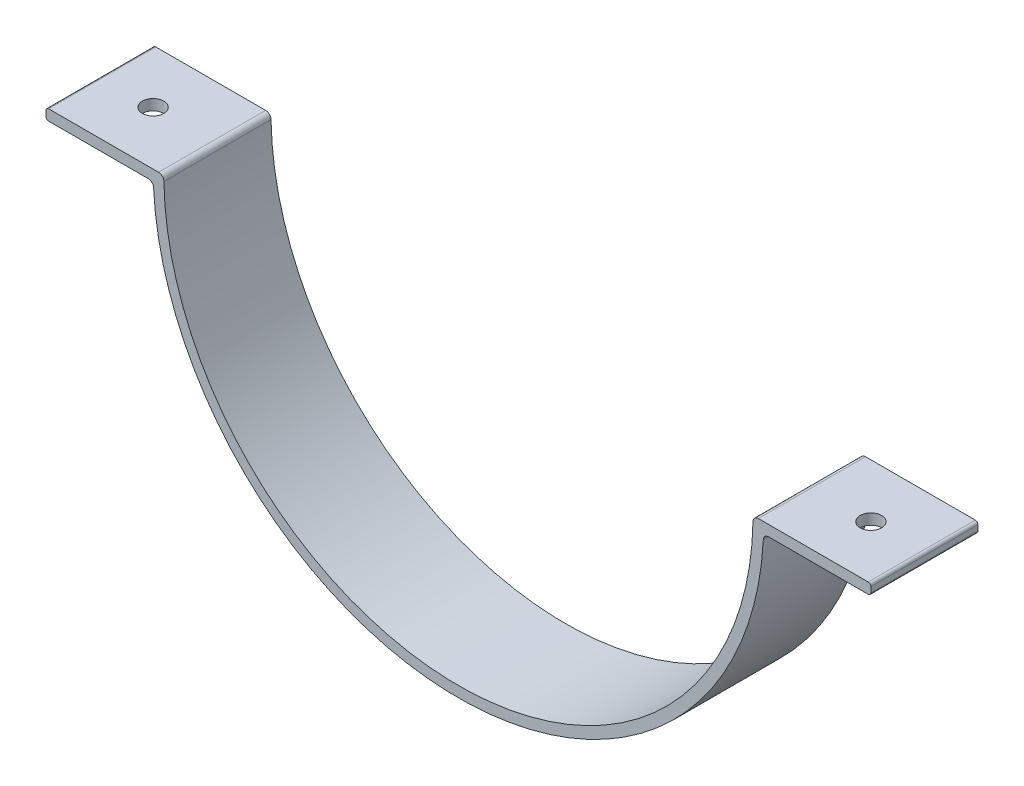
ISO-10303-21;
HEADER;
FILE_DESCRIPTION(('STEP AP214'),'2;1');
FILE_NAME('part.step','',(''),(''),'','','');
FILE_SCHEMA(('AUTOMOTIVE_DESIGN { 1 0 10303 214 1 1 1 1 }'));
ENDSEC;
DATA;
#1=APPLICATION_CONTEXT('core data for automotive mechanical design processes');
#2=APPLICATION_PROTOCOL_DEFINITION('international standard','automotive_design',2000,#1);
#3=PRODUCT_CONTEXT('',#1,'mechanical');
#4=PRODUCT('Part','Part','',(#3));
#5=PRODUCT_RELATED_PRODUCT_CATEGORY('part','',(#4));
#6=PRODUCT_DEFINITION_FORMATION('','',#4);
#7=PRODUCT_DEFINITION_CONTEXT('part definition',#1,'design');
#8=PRODUCT_DEFINITION('design','',#6,#7);
#9=PRODUCT_DEFINITION_SHAPE('','',#8);
#10=(LENGTH_UNIT() NAMED_UNIT(*) SI_UNIT(.MILLI.,.METRE.));
#11=(NAMED_UNIT(*) PLANE_ANGLE_UNIT() SI_UNIT($,.RADIAN.));
#12=(NAMED_UNIT(*) SI_UNIT($,.STERADIAN.) SOLID_ANGLE_UNIT());
#13=UNCERTAINTY_MEASURE_WITH_UNIT(LENGTH_MEASURE(1.E-05),#10,'distance_accuracy_value','');
#14=(GEOMETRIC_REPRESENTATION_CONTEXT(3) GLOBAL_UNCERTAINTY_ASSIGNED_CONTEXT((#13)) GLOBAL_UNIT_ASSIGNED_CONTEXT((#10,
#11,#12)) REPRESENTATION_CONTEXT('',''));
#15=CARTESIAN_POINT('',(0.,0.,0.));
#16=DIRECTION('',(0.,0.,1.));
#17=DIRECTION('',(1.,0.,0.));
#18=AXIS2_PLACEMENT_3D('',#15,#16,#17);
#19=CARTESIAN_POINT('',(-57.9223618302983,-3.,20.));
#20=DIRECTION('',(0.,0.,-1.));
#21=DIRECTION('',(-1.,0.,0.));
#22=AXIS2_PLACEMENT_3D('',#19,#20,#21);
#23=CYLINDRICAL_SURFACE('',#22,1.);
#24=CARTESIAN_POINT('',(-57.9223618302983,-3.,0.));
#25=DIRECTION('',(0.,0.,-1.));
#26=DIRECTION('',(1.,0.,0.));
#27=AXIS2_PLACEMENT_3D('',#24,#25,#26);
#28=CIRCLE('',#27,1.);
#29=CARTESIAN_POINT('',(-57.9223618302983,-2.,0.));
#30=VERTEX_POINT('',#29);
#31=CARTESIAN_POINT('',(-56.9237004194311,-2.94827586206897,0.));
#32=VERTEX_POINT('',#31);
#33=EDGE_CURVE('E178',#30,#32,#28,.T.);
#34=ORIENTED_EDGE('',*,*,#33,.T.);
#35=DIRECTION('',(0.,0.,-1.));
#36=VECTOR('',#35,1.);
#37=CARTESIAN_POINT('',(-56.9237004194311,-2.94827586206897,20.));
#38=LINE('',#37,#36);
#39=CARTESIAN_POINT('',(-56.9237004194311,-2.94827586206897,20.));
#40=VERTEX_POINT('',#39);
#41=EDGE_CURVE('E11',#40,#32,#38,.T.);
#42=ORIENTED_EDGE('',*,*,#41,.F.);
#43=CARTESIAN_POINT('',(-57.9223618302983,-3.,20.));
#44=DIRECTION('',(0.,0.,-1.));
#45=DIRECTION('',(1.,0.,0.));
#46=AXIS2_PLACEMENT_3D('',#43,#44,#45);
#47=CIRCLE('',#46,1.);
#48=CARTESIAN_POINT('',(-57.9223618302983,-2.,20.));
#49=VERTEX_POINT('',#48);
#50=EDGE_CURVE('E211',#49,#40,#47,.T.);
#51=ORIENTED_EDGE('',*,*,#50,.F.);
#52=DIRECTION('',(0.,0.,-1.));
#53=VECTOR('',#52,1.);
#54=CARTESIAN_POINT('',(-57.9223618302983,-2.,20.));
#55=LINE('',#54,#53);
#56=EDGE_CURVE('E174',#49,#30,#55,.T.);
#57=ORIENTED_EDGE('',*,*,#56,.T.);
#58=EDGE_LOOP('',(#34,#42,#51,#57));
#59=FACE_BOUND('',#58,.T.);
#60=ADVANCED_FACE('F32',(#59),#23,.F.);
#61=CARTESIAN_POINT('',(0.,0.,20.));
#62=DIRECTION('',(0.,0.,-1.));
#63=DIRECTION('',(-1.,0.,0.));
#64=AXIS2_PLACEMENT_3D('',#61,#62,#63);
#65=CYLINDRICAL_SURFACE('',#64,57.);
#66=CARTESIAN_POINT('',(0.,0.,0.));
#67=DIRECTION('',(0.,0.,1.));
#68=DIRECTION('',(1.,0.,0.));
#69=AXIS2_PLACEMENT_3D('',#66,#67,#68);
#70=CIRCLE('',#69,57.);
#71=CARTESIAN_POINT('',(56.9237004194311,-2.94827586206896,0.));
#72=VERTEX_POINT('',#71);
#73=EDGE_CURVE('E181',#32,#72,#70,.T.);
#74=ORIENTED_EDGE('',*,*,#73,.T.);
#75=DIRECTION('',(0.,0.,-1.));
#76=VECTOR('',#75,1.);
#77=CARTESIAN_POINT('',(56.9237004194311,-2.94827586206896,20.));
#78=LINE('',#77,#76);
#79=CARTESIAN_POINT('',(56.9237004194311,-2.94827586206896,20.));
#80=VERTEX_POINT('',#79);
#81=EDGE_CURVE('E41',#80,#72,#78,.T.);
#82=ORIENTED_EDGE('',*,*,#81,.F.);
#83=CARTESIAN_POINT('',(0.,0.,20.));
#84=DIRECTION('',(0.,0.,1.));
#85=DIRECTION('',(1.,0.,0.));
#86=AXIS2_PLACEMENT_3D('',#83,#84,#85);
#87=CIRCLE('',#86,57.);
#88=EDGE_CURVE('E117',#40,#80,#87,.T.);
#89=ORIENTED_EDGE('',*,*,#88,.F.);
#90=ORIENTED_EDGE('',*,*,#41,.T.);
#91=EDGE_LOOP('',(#74,#82,#89,#90));
#92=FACE_BOUND('',#91,.T.);
#93=ADVANCED_FACE('F309',(#92),#65,.T.);
#94=CARTESIAN_POINT('',(57.9223618302983,-3.,20.));
#95=DIRECTION('',(0.,0.,-1.));
#96=DIRECTION('',(-1.,0.,0.));
#97=AXIS2_PLACEMENT_3D('',#94,#95,#96);
#98=CYLINDRICAL_SURFACE('',#97,1.);
#99=CARTESIAN_POINT('',(57.9223618302983,-3.,0.));
#100=DIRECTION('',(0.,0.,-1.));
#101=DIRECTION('',(-1.,0.,0.));
#102=AXIS2_PLACEMENT_3D('',#99,#100,#101);
#103=CIRCLE('',#102,1.);
#104=CARTESIAN_POINT('',(57.9223618302983,-2.,0.));
#105=VERTEX_POINT('',#104);
#106=EDGE_CURVE('E184',#72,#105,#103,.T.);
#107=ORIENTED_EDGE('',*,*,#106,.T.);
#108=DIRECTION('',(0.,0.,-1.));
#109=VECTOR('',#108,1.);
#110=CARTESIAN_POINT('',(57.9223618302983,-2.,20.));
#111=LINE('',#110,#109);
#112=CARTESIAN_POINT('',(57.9223618302983,-2.,20.));
#113=VERTEX_POINT('',#112);
#114=EDGE_CURVE('E242',#113,#105,#111,.T.);
#115=ORIENTED_EDGE('',*,*,#114,.F.);
#116=CARTESIAN_POINT('',(57.9223618302983,-3.,20.));
#117=DIRECTION('',(0.,0.,-1.));
#118=DIRECTION('',(-1.,0.,0.));
#119=AXIS2_PLACEMENT_3D('',#116,#117,#118);
#120=CIRCLE('',#119,1.);
#121=EDGE_CURVE('E261',#80,#113,#120,.T.);
#122=ORIENTED_EDGE('',*,*,#121,.F.);
#123=ORIENTED_EDGE('',*,*,#81,.T.);
#124=EDGE_LOOP('',(#107,#115,#122,#123));
#125=FACE_BOUND('',#124,.T.);
#126=ADVANCED_FACE('F313',(#125),#98,.F.);
#127=CARTESIAN_POINT('',(76.5,-2.,20.));
#128=DIRECTION('',(0.,1.,0.));
#129=DIRECTION('',(0.,0.,1.));
#130=AXIS2_PLACEMENT_3D('',#127,#128,#129);
#131=PLANE('',#130);
#132=CARTESIAN_POINT('',(66.9999999999997,-2.,10.));
#133=DIRECTION('',(0.,1.,0.));
#134=DIRECTION('',(0.,0.,1.));
#135=AXIS2_PLACEMENT_3D('',#132,#133,#134);
#136=CIRCLE('',#135,2.);
#137=CARTESIAN_POINT('',(66.9999999999997,-2.,12.));
#138=VERTEX_POINT('',#137);
#139=EDGE_CURVE('E182',#138,#138,#136,.T.);
#140=ORIENTED_EDGE('',*,*,#139,.T.);
#141=EDGE_LOOP('',(#140));
#142=FACE_BOUND('',#141,.T.);
#143=DIRECTION('',(1.,0.,0.));
#144=VECTOR('',#143,1.);
#145=CARTESIAN_POINT('',(76.5,-2.,0.));
#146=LINE('',#145,#144);
#147=CARTESIAN_POINT('',(76.5,-2.,0.));
#148=VERTEX_POINT('',#147);
#149=EDGE_CURVE('E186',#105,#148,#146,.T.);
#150=ORIENTED_EDGE('',*,*,#149,.T.);
#151=DIRECTION('',(0.,0.,-1.));
#152=VECTOR('',#151,1.);
#153=CARTESIAN_POINT('',(76.5,-2.,20.));
#154=LINE('',#153,#152);
#155=CARTESIAN_POINT('',(76.5,-2.,20.));
#156=VERTEX_POINT('',#155);
#157=EDGE_CURVE('E239',#156,#148,#154,.T.);
#158=ORIENTED_EDGE('',*,*,#157,.F.);
#159=DIRECTION('',(1.,0.,0.));
#160=VECTOR('',#159,1.);
#161=CARTESIAN_POINT('',(76.5,-2.,20.));
#162=LINE('',#161,#160);
#163=EDGE_CURVE('E263',#113,#156,#162,.T.);
#164=ORIENTED_EDGE('',*,*,#163,.F.);
#165=ORIENTED_EDGE('',*,*,#114,.T.);
#166=EDGE_LOOP('',(#150,#158,#164,#165));
#167=FACE_BOUND('',#166,.T.);
#168=ADVANCED_FACE('F317',(#142,#167),#131,.F.);
#169=CARTESIAN_POINT('',(76.5,-1.5,20.));
#170=DIRECTION('',(0.,0.,-1.));
#171=DIRECTION('',(-1.,0.,0.));
#172=AXIS2_PLACEMENT_3D('',#169,#170,#171);
#173=CYLINDRICAL_SURFACE('',#172,0.5);
#174=CARTESIAN_POINT('',(76.5,-1.5,0.));
#175=DIRECTION('',(0.,0.,1.));
#176=DIRECTION('',(-1.,0.,0.));
#177=AXIS2_PLACEMENT_3D('',#174,#175,#176);
#178=CIRCLE('',#177,0.5);
#179=CARTESIAN_POINT('',(77.,-1.5,0.));
#180=VERTEX_POINT('',#179);
#181=EDGE_CURVE('E188',#148,#180,#178,.T.);
#182=ORIENTED_EDGE('',*,*,#181,.T.);
#183=DIRECTION('',(0.,0.,-1.));
#184=VECTOR('',#183,1.);
#185=CARTESIAN_POINT('',(77.,-1.5,20.));
#186=LINE('',#185,#184);
#187=CARTESIAN_POINT('',(77.,-1.5,20.));
#188=VERTEX_POINT('',#187);
#189=EDGE_CURVE('E236',#188,#180,#186,.T.);
#190=ORIENTED_EDGE('',*,*,#189,.F.);
#191=CARTESIAN_POINT('',(76.5,-1.5,20.));
#192=DIRECTION('',(0.,0.,1.));
#193=DIRECTION('',(-1.,0.,0.));
#194=AXIS2_PLACEMENT_3D('',#191,#192,#193);
#195=CIRCLE('',#194,0.5);
#196=EDGE_CURVE('E265',#156,#188,#195,.T.);
#197=ORIENTED_EDGE('',*,*,#196,.F.);
#198=ORIENTED_EDGE('',*,*,#157,.T.);
#199=EDGE_LOOP('',(#182,#190,#197,#198));
#200=FACE_BOUND('',#199,.T.);
#201=ADVANCED_FACE('F323',(#200),#173,.T.);
#202=CARTESIAN_POINT('',(77.,-0.500000000000018,20.));
#203=DIRECTION('',(-1.,0.,0.));
#204=DIRECTION('',(0.,-1.,0.));
#205=AXIS2_PLACEMENT_3D('',#202,#203,#204);
#206=PLANE('',#205);
#207=DIRECTION('',(0.,1.,0.));
#208=VECTOR('',#207,1.);
#209=CARTESIAN_POINT('',(77.,-0.500000000000018,0.));
#210=LINE('',#209,#208);
#211=CARTESIAN_POINT('',(77.,-0.500000000000018,0.));
#212=VERTEX_POINT('',#211);
#213=EDGE_CURVE('E190',#180,#212,#210,.T.);
#214=ORIENTED_EDGE('',*,*,#213,.T.);
#215=DIRECTION('',(0.,0.,-1.));
#216=VECTOR('',#215,1.);
#217=CARTESIAN_POINT('',(77.,-0.500000000000018,20.));
#218=LINE('',#217,#216);
#219=CARTESIAN_POINT('',(77.,-0.500000000000018,20.));
#220=VERTEX_POINT('',#219);
#221=EDGE_CURVE('E233',#220,#212,#218,.T.);
#222=ORIENTED_EDGE('',*,*,#221,.F.);
#223=DIRECTION('',(0.,1.,0.));
#224=VECTOR('',#223,1.);
#225=CARTESIAN_POINT('',(77.,-0.500000000000018,20.));
#226=LINE('',#225,#224);
#227=EDGE_CURVE('E267',#188,#220,#226,.T.);
#228=ORIENTED_EDGE('',*,*,#227,.F.);
#229=ORIENTED_EDGE('',*,*,#189,.T.);
#230=EDGE_LOOP('',(#214,#222,#228,#229));
#231=FACE_BOUND('',#230,.T.);
#232=ADVANCED_FACE('F327',(#231),#206,.F.);
#233=CARTESIAN_POINT('',(76.5,-0.500000000000011,20.));
#234=DIRECTION('',(0.,0.,-1.));
#235=DIRECTION('',(-1.,0.,0.));
#236=AXIS2_PLACEMENT_3D('',#233,#234,#235);
#237=CYLINDRICAL_SURFACE('',#236,0.5);
#238=CARTESIAN_POINT('',(76.5,-0.500000000000011,0.));
#239=DIRECTION('',(0.,0.,1.));
#240=DIRECTION('',(1.,0.,0.));
#241=AXIS2_PLACEMENT_3D('',#238,#239,#240);
#242=CIRCLE('',#241,0.5);
#243=CARTESIAN_POINT('',(76.5,0.,0.));
#244=VERTEX_POINT('',#243);
#245=EDGE_CURVE('E192',#212,#244,#242,.T.);
#246=ORIENTED_EDGE('',*,*,#245,.T.);
#247=DIRECTION('',(0.,0.,-1.));
#248=VECTOR('',#247,1.);
#249=CARTESIAN_POINT('',(76.5,0.,20.));
#250=LINE('',#249,#248);
#251=CARTESIAN_POINT('',(76.5,0.,20.));
#252=VERTEX_POINT('',#251);
#253=EDGE_CURVE('E230',#252,#244,#250,.T.);
#254=ORIENTED_EDGE('',*,*,#253,.F.);
#255=CARTESIAN_POINT('',(76.5,-0.500000000000011,20.));
#256=DIRECTION('',(0.,0.,1.));
#257=DIRECTION('',(1.,0.,0.));
#258=AXIS2_PLACEMENT_3D('',#255,#256,#257);
#259=CIRCLE('',#258,0.5);
#260=EDGE_CURVE('E269',#220,#252,#259,.T.);
#261=ORIENTED_EDGE('',*,*,#260,.F.);
#262=ORIENTED_EDGE('',*,*,#221,.T.);
#263=EDGE_LOOP('',(#246,#254,#261,#262));
#264=FACE_BOUND('',#263,.T.);
#265=ADVANCED_FACE('F331',(#264),#237,.T.);
#266=CARTESIAN_POINT('',(57.,-3.59018503583753E-13,20.));
#267=DIRECTION('',(-1.79509251791877E-13,-1.,0.));
#268=DIRECTION('',(1.,-1.79509251791877E-13,0.));
#269=AXIS2_PLACEMENT_3D('',#266,#267,#268);
#270=PLANE('',#269);
#271=CARTESIAN_POINT('',(67.0000000000001,-2.15799600411515E-12,10.));
#272=DIRECTION('',(-1.79509251791877E-13,-1.,0.));
#273=DIRECTION('',(1.,-1.79509251791877E-13,0.));
#274=AXIS2_PLACEMENT_3D('',#271,#272,#273);
#275=CIRCLE('',#274,2.);
#276=CARTESIAN_POINT('',(69.0000000000001,-2.5170145076989E-12,10.));
#277=VERTEX_POINT('',#276);
#278=EDGE_CURVE('E246',#277,#277,#275,.T.);
#279=ORIENTED_EDGE('',*,*,#278,.T.);
#280=EDGE_LOOP('',(#279));
#281=FACE_BOUND('',#280,.T.);
#282=DIRECTION('',(-1.,1.79509251791877E-13,0.));
#283=VECTOR('',#282,1.);
#284=CARTESIAN_POINT('',(57.,-3.59018503583753E-13,0.));
#285=LINE('',#284,#283);
#286=CARTESIAN_POINT('',(55.9910707166779,-1.77906362823681E-13,0.));
#287=VERTEX_POINT('',#286);
#288=EDGE_CURVE('E195',#244,#287,#285,.T.);
#289=ORIENTED_EDGE('',*,*,#288,.T.);
#290=DIRECTION('',(0.,0.,-1.));
#291=VECTOR('',#290,1.);
#292=CARTESIAN_POINT('',(55.9910707166779,-1.77906362823681E-13,20.));
#293=LINE('',#292,#291);
#294=CARTESIAN_POINT('',(55.9910707166779,-1.77906362823681E-13,20.));
#295=VERTEX_POINT('',#294);
#296=EDGE_CURVE('E227',#295,#287,#293,.T.);
#297=ORIENTED_EDGE('',*,*,#296,.F.);
#298=DIRECTION('',(-1.,0.,0.));
#299=VECTOR('',#298,1.);
#300=CARTESIAN_POINT('',(57.,-3.59018503583753E-13,20.));
#301=LINE('',#300,#299);
#302=EDGE_CURVE('E271',#252,#295,#301,.T.);
#303=ORIENTED_EDGE('',*,*,#302,.F.);
#304=ORIENTED_EDGE('',*,*,#253,.T.);
#305=EDGE_LOOP('',(#289,#297,#303,#304));
#306=FACE_BOUND('',#305,.T.);
#307=ADVANCED_FACE('F335',(#281,#306),#270,.F.);
#308=CARTESIAN_POINT('',(55.9910707166777,-1.00000000000018,20.));
#309=DIRECTION('',(0.,0.,-1.));
#310=DIRECTION('',(-1.,0.,0.));
#311=AXIS2_PLACEMENT_3D('',#308,#309,#310);
#312=CYLINDRICAL_SURFACE('',#311,0.999999999999999);
#313=CARTESIAN_POINT('',(55.9910707166777,-1.00000000000018,0.));
#314=DIRECTION('',(0.,0.,1.));
#315=DIRECTION('',(-1.,0.,0.));
#316=AXIS2_PLACEMENT_3D('',#313,#314,#315);
#317=CIRCLE('',#316,0.999999999999999);
#318=CARTESIAN_POINT('',(54.9912301681656,-0.982142857143032,0.));
#319=VERTEX_POINT('',#318);
#320=EDGE_CURVE('E197',#287,#319,#317,.T.);
#321=ORIENTED_EDGE('',*,*,#320,.T.);
#322=DIRECTION('',(0.,0.,-1.));
#323=VECTOR('',#322,1.);
#324=CARTESIAN_POINT('',(54.9912301681656,-0.982142857143032,20.));
#325=LINE('',#324,#323);
#326=CARTESIAN_POINT('',(54.9912301681656,-0.982142857143032,20.));
#327=VERTEX_POINT('',#326);
#328=EDGE_CURVE('E224',#327,#319,#325,.T.);
#329=ORIENTED_EDGE('',*,*,#328,.F.);
#330=CARTESIAN_POINT('',(55.9910707166777,-1.00000000000018,20.));
#331=DIRECTION('',(0.,0.,1.));
#332=DIRECTION('',(-1.,0.,0.));
#333=AXIS2_PLACEMENT_3D('',#330,#331,#332);
#334=CIRCLE('',#333,0.999999999999999);
#335=EDGE_CURVE('E273',#295,#327,#334,.T.);
#336=ORIENTED_EDGE('',*,*,#335,.F.);
#337=ORIENTED_EDGE('',*,*,#296,.T.);
#338=EDGE_LOOP('',(#321,#329,#336,#337));
#339=FACE_BOUND('',#338,.T.);
#340=ADVANCED_FACE('F339',(#339),#312,.T.);
#341=CARTESIAN_POINT('',(0.,0.,20.));
#342=DIRECTION('',(0.,0.,-1.));
#343=DIRECTION('',(-1.,0.,0.));
#344=AXIS2_PLACEMENT_3D('',#341,#342,#343);
#345=CYLINDRICAL_SURFACE('',#344,55.);
#346=CARTESIAN_POINT('',(0.,0.,0.));
#347=DIRECTION('',(0.,0.,-1.));
#348=DIRECTION('',(1.,0.,0.));
#349=AXIS2_PLACEMENT_3D('',#346,#347,#348);
#350=CIRCLE('',#349,55.);
#351=CARTESIAN_POINT('',(-54.9912301681656,-0.982142857143017,0.));
#352=VERTEX_POINT('',#351);
#353=EDGE_CURVE('E199',#319,#352,#350,.T.);
#354=ORIENTED_EDGE('',*,*,#353,.T.);
#355=DIRECTION('',(0.,0.,-1.));
#356=VECTOR('',#355,1.);
#357=CARTESIAN_POINT('',(-54.9912301681656,-0.982142857143017,20.));
#358=LINE('',#357,#356);
#359=CARTESIAN_POINT('',(-54.9912301681656,-0.982142857143017,20.));
#360=VERTEX_POINT('',#359);
#361=EDGE_CURVE('E221',#360,#352,#358,.T.);
#362=ORIENTED_EDGE('',*,*,#361,.F.);
#363=CARTESIAN_POINT('',(0.,0.,20.));
#364=DIRECTION('',(0.,0.,-1.));
#365=DIRECTION('',(1.,0.,0.));
#366=AXIS2_PLACEMENT_3D('',#363,#364,#365);
#367=CIRCLE('',#366,55.);
#368=EDGE_CURVE('E275',#327,#360,#367,.T.);
#369=ORIENTED_EDGE('',*,*,#368,.F.);
#370=ORIENTED_EDGE('',*,*,#328,.T.);
#371=EDGE_LOOP('',(#354,#362,#369,#370));
#372=FACE_BOUND('',#371,.T.);
#373=ADVANCED_FACE('F342',(#372),#345,.F.);
#374=CARTESIAN_POINT('',(-55.9910707166777,-1.00000000000018,20.));
#375=DIRECTION('',(0.,0.,-1.));
#376=DIRECTION('',(-1.,0.,0.));
#377=AXIS2_PLACEMENT_3D('',#374,#375,#376);
#378=CYLINDRICAL_SURFACE('',#377,0.999999999999999);
#379=CARTESIAN_POINT('',(-55.9910707166777,-1.00000000000018,0.));
#380=DIRECTION('',(0.,0.,1.));
#381=DIRECTION('',(1.,0.,0.));
#382=AXIS2_PLACEMENT_3D('',#379,#380,#381);
#383=CIRCLE('',#382,0.999999999999999);
#384=CARTESIAN_POINT('',(-55.9910707166779,-1.79110198894605E-13,0.));
#385=VERTEX_POINT('',#384);
#386=EDGE_CURVE('E201',#352,#385,#383,.T.);
#387=ORIENTED_EDGE('',*,*,#386,.T.);
#388=DIRECTION('',(0.,0.,-1.));
#389=VECTOR('',#388,1.);
#390=CARTESIAN_POINT('',(-55.9910707166779,-1.79110198894605E-13,20.));
#391=LINE('',#390,#389);
#392=CARTESIAN_POINT('',(-55.9910707166779,-1.79110198894605E-13,20.));
#393=VERTEX_POINT('',#392);
#394=EDGE_CURVE('E218',#393,#385,#391,.T.);
#395=ORIENTED_EDGE('',*,*,#394,.F.);
#396=CARTESIAN_POINT('',(-55.9910707166777,-1.00000000000018,20.));
#397=DIRECTION('',(0.,0.,1.));
#398=DIRECTION('',(1.,0.,0.));
#399=AXIS2_PLACEMENT_3D('',#396,#397,#398);
#400=CIRCLE('',#399,0.999999999999999);
#401=EDGE_CURVE('E277',#360,#393,#400,.T.);
#402=ORIENTED_EDGE('',*,*,#401,.F.);
#403=ORIENTED_EDGE('',*,*,#361,.T.);
#404=EDGE_LOOP('',(#387,#395,#402,#403));
#405=FACE_BOUND('',#404,.T.);
#406=ADVANCED_FACE('F346',(#405),#378,.T.);
#407=CARTESIAN_POINT('',(-57.,-3.59018503583753E-13,20.));
#408=DIRECTION('',(0.,-1.,0.));
#409=DIRECTION('',(1.,0.,0.));
#410=AXIS2_PLACEMENT_3D('',#407,#408,#409);
#411=PLANE('',#410);
#412=CARTESIAN_POINT('',(-67.0000000000001,-1.80411241501588E-13,10.));
#413=DIRECTION('',(0.,-1.,0.));
#414=DIRECTION('',(1.,0.,0.));
#415=AXIS2_PLACEMENT_3D('',#412,#413,#414);
#416=CIRCLE('',#415,2.);
#417=CARTESIAN_POINT('',(-65.0000000000001,-2.16068162500134E-13,10.));
#418=VERTEX_POINT('',#417);
#419=EDGE_CURVE('E248',#418,#418,#416,.F.);
#420=ORIENTED_EDGE('',*,*,#419,.F.);
#421=EDGE_LOOP('',(#420));
#422=FACE_BOUND('',#421,.T.);
#423=DIRECTION('',(-1.,0.,0.));
#424=VECTOR('',#423,1.);
#425=CARTESIAN_POINT('',(-57.,-3.59018503583753E-13,0.));
#426=LINE('',#425,#424);
#427=CARTESIAN_POINT('',(-76.5,0.,0.));
#428=VERTEX_POINT('',#427);
#429=EDGE_CURVE('E204',#385,#428,#426,.T.);
#430=ORIENTED_EDGE('',*,*,#429,.T.);
#431=DIRECTION('',(0.,0.,-1.));
#432=VECTOR('',#431,1.);
#433=CARTESIAN_POINT('',(-76.5,0.,20.));
#434=LINE('',#433,#432);
#435=CARTESIAN_POINT('',(-76.5,0.,20.));
#436=VERTEX_POINT('',#435);
#437=EDGE_CURVE('E215',#436,#428,#434,.T.);
#438=ORIENTED_EDGE('',*,*,#437,.F.);
#439=DIRECTION('',(-1.,-1.79509251791877E-13,0.));
#440=VECTOR('',#439,1.);
#441=CARTESIAN_POINT('',(-57.,-3.59018503583753E-13,20.));
#442=LINE('',#441,#440);
#443=EDGE_CURVE('E279',#393,#436,#442,.T.);
#444=ORIENTED_EDGE('',*,*,#443,.F.);
#445=ORIENTED_EDGE('',*,*,#394,.T.);
#446=EDGE_LOOP('',(#430,#438,#444,#445));
#447=FACE_BOUND('',#446,.T.);
#448=ADVANCED_FACE('F285',(#422,#447),#411,.F.);
#449=CARTESIAN_POINT('',(-76.5,-0.500000000000011,20.));
#450=DIRECTION('',(0.,0.,-1.));
#451=DIRECTION('',(-1.,0.,0.));
#452=AXIS2_PLACEMENT_3D('',#449,#450,#451);
#453=CYLINDRICAL_SURFACE('',#452,0.5);
#454=CARTESIAN_POINT('',(-76.5,-0.500000000000011,0.));
#455=DIRECTION('',(0.,0.,1.));
#456=DIRECTION('',(-1.,0.,0.));
#457=AXIS2_PLACEMENT_3D('',#454,#455,#456);
#458=CIRCLE('',#457,0.5);
#459=CARTESIAN_POINT('',(-77.,-0.500000000000019,0.));
#460=VERTEX_POINT('',#459);
#461=EDGE_CURVE('E206',#428,#460,#458,.T.);
#462=ORIENTED_EDGE('',*,*,#461,.T.);
#463=DIRECTION('',(0.,0.,-1.));
#464=VECTOR('',#463,1.);
#465=CARTESIAN_POINT('',(-77.,-0.500000000000019,20.));
#466=LINE('',#465,#464);
#467=CARTESIAN_POINT('',(-77.,-0.500000000000019,20.));
#468=VERTEX_POINT('',#467);
#469=EDGE_CURVE('E169',#468,#460,#466,.T.);
#470=ORIENTED_EDGE('',*,*,#469,.F.);
#471=CARTESIAN_POINT('',(-76.5,-0.500000000000011,20.));
#472=DIRECTION('',(0.,0.,1.));
#473=DIRECTION('',(-1.,0.,0.));
#474=AXIS2_PLACEMENT_3D('',#471,#472,#473);
#475=CIRCLE('',#474,0.5);
#476=EDGE_CURVE('E160',#436,#468,#475,.T.);
#477=ORIENTED_EDGE('',*,*,#476,.F.);
#478=ORIENTED_EDGE('',*,*,#437,.T.);
#479=EDGE_LOOP('',(#462,#470,#477,#478));
#480=FACE_BOUND('',#479,.T.);
#481=ADVANCED_FACE('F288',(#480),#453,.T.);
#482=CARTESIAN_POINT('',(-77.,-0.500000000000018,20.));
#483=DIRECTION('',(1.,0.,0.));
#484=DIRECTION('',(0.,1.,0.));
#485=AXIS2_PLACEMENT_3D('',#482,#483,#484);
#486=PLANE('',#485);
#487=DIRECTION('',(0.,-1.,0.));
#488=VECTOR('',#487,1.);
#489=CARTESIAN_POINT('',(-77.,-0.500000000000018,0.));
#490=LINE('',#489,#488);
#491=CARTESIAN_POINT('',(-77.,-1.5,0.));
#492=VERTEX_POINT('',#491);
#493=EDGE_CURVE('E168',#460,#492,#490,.T.);
#494=ORIENTED_EDGE('',*,*,#493,.T.);
#495=DIRECTION('',(0.,0.,-1.));
#496=VECTOR('',#495,1.);
#497=CARTESIAN_POINT('',(-77.,-1.5,20.));
#498=LINE('',#497,#496);
#499=CARTESIAN_POINT('',(-77.,-1.5,20.));
#500=VERTEX_POINT('',#499);
#501=EDGE_CURVE('E165',#500,#492,#498,.T.);
#502=ORIENTED_EDGE('',*,*,#501,.F.);
#503=DIRECTION('',(0.,-1.,0.));
#504=VECTOR('',#503,1.);
#505=CARTESIAN_POINT('',(-77.,-0.500000000000018,20.));
#506=LINE('',#505,#504);
#507=EDGE_CURVE('E154',#468,#500,#506,.T.);
#508=ORIENTED_EDGE('',*,*,#507,.F.);
#509=ORIENTED_EDGE('',*,*,#469,.T.);
#510=EDGE_LOOP('',(#494,#502,#508,#509));
#511=FACE_BOUND('',#510,.T.);
#512=ADVANCED_FACE('F166',(#511),#486,.F.);
#513=CARTESIAN_POINT('',(-76.5,-1.5,20.));
#514=DIRECTION('',(0.,0.,-1.));
#515=DIRECTION('',(-1.,0.,0.));
#516=AXIS2_PLACEMENT_3D('',#513,#514,#515);
#517=CYLINDRICAL_SURFACE('',#516,0.5);
#518=CARTESIAN_POINT('',(-76.5,-1.5,0.));
#519=DIRECTION('',(0.,0.,1.));
#520=DIRECTION('',(1.,0.,0.));
#521=AXIS2_PLACEMENT_3D('',#518,#519,#520);
#522=CIRCLE('',#521,0.5);
#523=CARTESIAN_POINT('',(-76.5,-2.,0.));
#524=VERTEX_POINT('',#523);
#525=EDGE_CURVE('E103',#492,#524,#522,.T.);
#526=ORIENTED_EDGE('',*,*,#525,.T.);
#527=DIRECTION('',(0.,0.,-1.));
#528=VECTOR('',#527,1.);
#529=CARTESIAN_POINT('',(-76.5,-2.,20.));
#530=LINE('',#529,#528);
#531=CARTESIAN_POINT('',(-76.5,-2.,20.));
#532=VERTEX_POINT('',#531);
#533=EDGE_CURVE('E170',#532,#524,#530,.T.);
#534=ORIENTED_EDGE('',*,*,#533,.F.);
#535=CARTESIAN_POINT('',(-76.5,-1.5,20.));
#536=DIRECTION('',(0.,0.,1.));
#537=DIRECTION('',(1.,0.,0.));
#538=AXIS2_PLACEMENT_3D('',#535,#536,#537);
#539=CIRCLE('',#538,0.5);
#540=EDGE_CURVE('E158',#500,#532,#539,.T.);
#541=ORIENTED_EDGE('',*,*,#540,.F.);
#542=ORIENTED_EDGE('',*,*,#501,.T.);
#543=EDGE_LOOP('',(#526,#534,#541,#542));
#544=FACE_BOUND('',#543,.T.);
#545=ADVANCED_FACE('F172',(#544),#517,.T.);
#546=CARTESIAN_POINT('',(-76.5,-2.,20.));
#547=DIRECTION('',(0.,1.,0.));
#548=DIRECTION('',(0.,0.,1.));
#549=AXIS2_PLACEMENT_3D('',#546,#547,#548);
#550=PLANE('',#549);
#551=CARTESIAN_POINT('',(-66.9999999999997,-2.,10.));
#552=DIRECTION('',(0.,1.,0.));
#553=DIRECTION('',(0.,0.,1.));
#554=AXIS2_PLACEMENT_3D('',#551,#552,#553);
#555=CIRCLE('',#554,2.);
#556=CARTESIAN_POINT('',(-66.9999999999997,-2.,12.));
#557=VERTEX_POINT('',#556);
#558=EDGE_CURVE('E35',#557,#557,#555,.F.);
#559=ORIENTED_EDGE('',*,*,#558,.F.);
#560=EDGE_LOOP('',(#559));
#561=FACE_BOUND('',#560,.T.);
#562=DIRECTION('',(1.,0.,0.));
#563=VECTOR('',#562,1.);
#564=CARTESIAN_POINT('',(-76.5,-2.,0.));
#565=LINE('',#564,#563);
#566=EDGE_CURVE('E109',#524,#30,#565,.T.);
#567=ORIENTED_EDGE('',*,*,#566,.T.);
#568=ORIENTED_EDGE('',*,*,#56,.F.);
#569=DIRECTION('',(1.,0.,0.));
#570=VECTOR('',#569,1.);
#571=CARTESIAN_POINT('',(-76.5,-2.,20.));
#572=LINE('',#571,#570);
#573=EDGE_CURVE('E50',#532,#49,#572,.T.);
#574=ORIENTED_EDGE('',*,*,#573,.F.);
#575=ORIENTED_EDGE('',*,*,#533,.T.);
#576=EDGE_LOOP('',(#567,#568,#574,#575));
#577=FACE_BOUND('',#576,.T.);
#578=ADVANCED_FACE('F296',(#561,#577),#550,.F.);
#579=CARTESIAN_POINT('',(-57.9223618302983,-3.,20.));
#580=DIRECTION('',(0.,0.,1.));
#581=DIRECTION('',(1.,0.,0.));
#582=AXIS2_PLACEMENT_3D('',#579,#580,#581);
#583=PLANE('',#582);
#584=ORIENTED_EDGE('',*,*,#50,.T.);
#585=ORIENTED_EDGE('',*,*,#88,.T.);
#586=ORIENTED_EDGE('',*,*,#121,.T.);
#587=ORIENTED_EDGE('',*,*,#163,.T.);
#588=ORIENTED_EDGE('',*,*,#196,.T.);
#589=ORIENTED_EDGE('',*,*,#227,.T.);
#590=ORIENTED_EDGE('',*,*,#260,.T.);
#591=ORIENTED_EDGE('',*,*,#302,.T.);
#592=ORIENTED_EDGE('',*,*,#335,.T.);
#593=ORIENTED_EDGE('',*,*,#368,.T.);
#594=ORIENTED_EDGE('',*,*,#401,.T.);
#595=ORIENTED_EDGE('',*,*,#443,.T.);
#596=ORIENTED_EDGE('',*,*,#476,.T.);
#597=ORIENTED_EDGE('',*,*,#507,.T.);
#598=ORIENTED_EDGE('',*,*,#540,.T.);
#599=ORIENTED_EDGE('',*,*,#573,.T.);
#600=EDGE_LOOP('',(#584,#585,#586,#587,#588,#589,#590,#591,#592,#593,#594,#595,#596,#597,#598,#599));
#601=FACE_BOUND('',#600,.T.);
#602=ADVANCED_FACE('F156',(#601),#583,.T.);
#603=CARTESIAN_POINT('',(-57.9223618302983,-3.,0.));
#604=DIRECTION('',(0.,0.,1.));
#605=DIRECTION('',(1.,0.,0.));
#606=AXIS2_PLACEMENT_3D('',#603,#604,#605);
#607=PLANE('',#606);
#608=ORIENTED_EDGE('',*,*,#33,.F.);
#609=ORIENTED_EDGE('',*,*,#566,.F.);
#610=ORIENTED_EDGE('',*,*,#525,.F.);
#611=ORIENTED_EDGE('',*,*,#493,.F.);
#612=ORIENTED_EDGE('',*,*,#461,.F.);
#613=ORIENTED_EDGE('',*,*,#429,.F.);
#614=ORIENTED_EDGE('',*,*,#386,.F.);
#615=ORIENTED_EDGE('',*,*,#353,.F.);
#616=ORIENTED_EDGE('',*,*,#320,.F.);
#617=ORIENTED_EDGE('',*,*,#288,.F.);
#618=ORIENTED_EDGE('',*,*,#245,.F.);
#619=ORIENTED_EDGE('',*,*,#213,.F.);
#620=ORIENTED_EDGE('',*,*,#181,.F.);
#621=ORIENTED_EDGE('',*,*,#149,.F.);
#622=ORIENTED_EDGE('',*,*,#106,.F.);
#623=ORIENTED_EDGE('',*,*,#73,.F.);
#624=EDGE_LOOP('',(#608,#609,#610,#611,#612,#613,#614,#615,#616,#617,#618,#619,#620,#621,#622,#623));
#625=FACE_BOUND('',#624,.T.);
#626=ADVANCED_FACE('F291',(#625),#607,.F.);
#627=CARTESIAN_POINT('',(66.9999999999899,-57.0000000000258,10.));
#628=DIRECTION('',(1.79509251791877E-13,1.,0.));
#629=DIRECTION('',(-1.,1.79509251791877E-13,0.));
#630=AXIS2_PLACEMENT_3D('',#627,#628,#629);
#631=CYLINDRICAL_SURFACE('',#630,2.);
#632=ORIENTED_EDGE('',*,*,#278,.F.);
#633=EDGE_LOOP('',(#632));
#634=FACE_BOUND('',#633,.T.);
#635=ORIENTED_EDGE('',*,*,#139,.F.);
#636=EDGE_LOOP('',(#635));
#637=FACE_BOUND('',#636,.T.);
#638=ADVANCED_FACE('F383',(#634,#637),#631,.F.);
#639=CARTESIAN_POINT('',(-66.9999999999899,-57.0000000000258,10.));
#640=DIRECTION('',(-1.79509251791877E-13,1.,0.));
#641=DIRECTION('',(-1.,-1.79509251791877E-13,0.));
#642=AXIS2_PLACEMENT_3D('',#639,#640,#641);
#643=CYLINDRICAL_SURFACE('',#642,2.);
#644=ORIENTED_EDGE('',*,*,#558,.T.);
#645=EDGE_LOOP('',(#644));
#646=FACE_BOUND('',#645,.T.);
#647=ORIENTED_EDGE('',*,*,#419,.T.);
#648=EDGE_LOOP('',(#647));
#649=FACE_BOUND('',#648,.T.);
#650=ADVANCED_FACE('F407',(#646,#649),#643,.F.);
#651=CLOSED_SHELL('',(#60,#93,#126,#168,#201,#232,#265,#307,#340,#373,#406,#448,#481,#512,#545,
#578,#602,#626,#638,#650));
#652=MANIFOLD_SOLID_BREP('B2',#651);
#653=ADVANCED_BREP_SHAPE_REPRESENTATION('',(#18,#652),#14);
#654=SHAPE_DEFINITION_REPRESENTATION(#9,#653);
ENDSEC;
END-ISO-10303-21;
